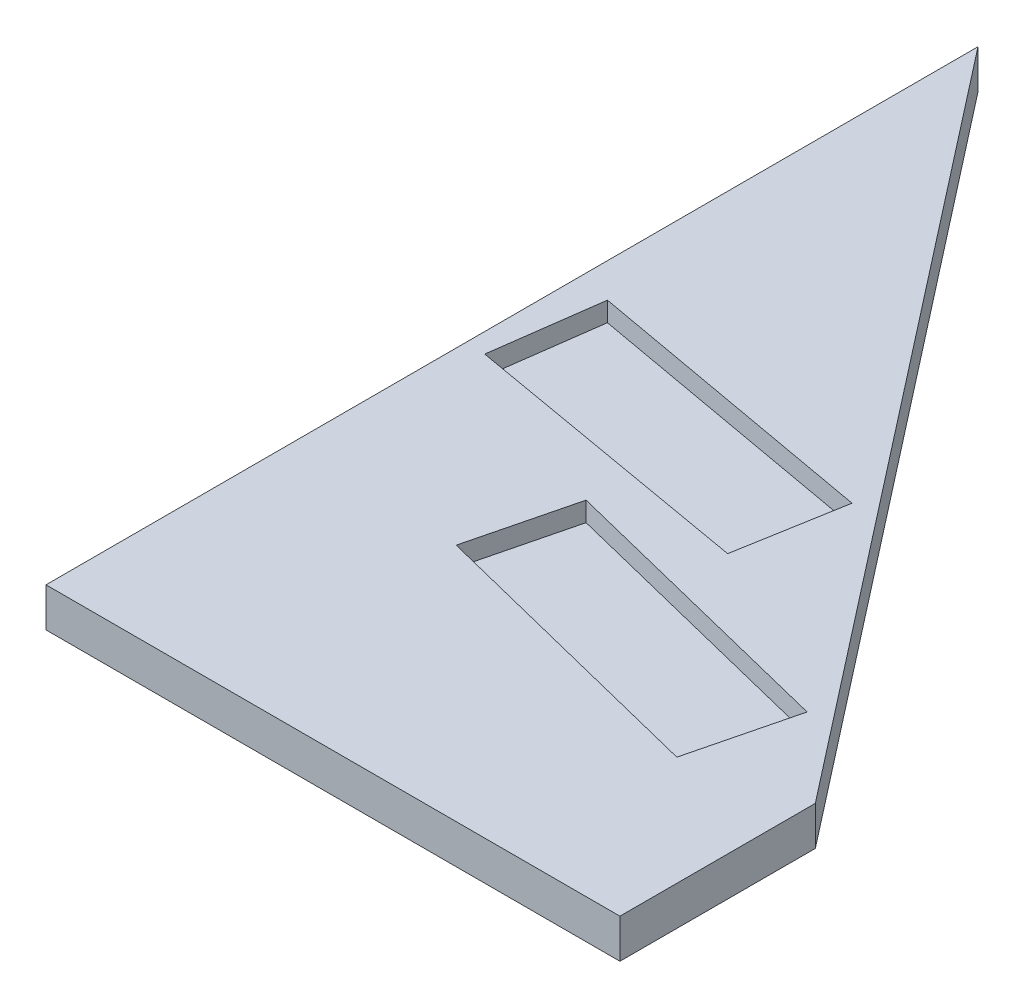
ISO-10303-21;
HEADER;
FILE_DESCRIPTION(('STEP AP214'),'2;1');
FILE_NAME('part.step','',(''),(''),'','','');
FILE_SCHEMA(('AUTOMOTIVE_DESIGN { 1 0 10303 214 1 1 1 1 }'));
ENDSEC;
DATA;
#1=APPLICATION_CONTEXT('core data for automotive mechanical design processes');
#2=APPLICATION_PROTOCOL_DEFINITION('international standard','automotive_design',2000,#1);
#3=PRODUCT_CONTEXT('',#1,'mechanical');
#4=PRODUCT('Part','Part','',(#3));
#5=PRODUCT_RELATED_PRODUCT_CATEGORY('part','',(#4));
#6=PRODUCT_DEFINITION_FORMATION('','',#4);
#7=PRODUCT_DEFINITION_CONTEXT('part definition',#1,'design');
#8=PRODUCT_DEFINITION('design','',#6,#7);
#9=PRODUCT_DEFINITION_SHAPE('','',#8);
#10=(LENGTH_UNIT() NAMED_UNIT(*) SI_UNIT(.MILLI.,.METRE.));
#11=(NAMED_UNIT(*) PLANE_ANGLE_UNIT() SI_UNIT($,.RADIAN.));
#12=(NAMED_UNIT(*) SI_UNIT($,.STERADIAN.) SOLID_ANGLE_UNIT());
#13=UNCERTAINTY_MEASURE_WITH_UNIT(LENGTH_MEASURE(1.E-05),#10,'distance_accuracy_value','');
#14=(GEOMETRIC_REPRESENTATION_CONTEXT(3) GLOBAL_UNCERTAINTY_ASSIGNED_CONTEXT((#13)) GLOBAL_UNIT_ASSIGNED_CONTEXT((#10,
#11,#12)) REPRESENTATION_CONTEXT('',''));
#15=CARTESIAN_POINT('',(0.,0.,0.));
#16=DIRECTION('',(0.,0.,1.));
#17=DIRECTION('',(1.,0.,0.));
#18=AXIS2_PLACEMENT_3D('',#15,#16,#17);
#19=CARTESIAN_POINT('',(-25.,4.,-50.39));
#20=DIRECTION('',(1.,0.,0.));
#21=DIRECTION('',(0.,0.,-1.));
#22=AXIS2_PLACEMENT_3D('',#19,#20,#21);
#23=PLANE('',#22);
#24=DIRECTION('',(0.,0.,1.));
#25=VECTOR('',#24,1.);
#26=CARTESIAN_POINT('',(-25.,0.,-50.39));
#27=LINE('',#26,#25);
#28=CARTESIAN_POINT('',(-25.,0.,-50.39));
#29=VERTEX_POINT('',#28);
#30=CARTESIAN_POINT('',(-25.,0.,45.));
#31=VERTEX_POINT('',#30);
#32=EDGE_CURVE('E216',#29,#31,#27,.T.);
#33=ORIENTED_EDGE('',*,*,#32,.T.);
#34=DIRECTION('',(0.,-1.,0.));
#35=VECTOR('',#34,1.);
#36=CARTESIAN_POINT('',(-25.,4.,45.));
#37=LINE('',#36,#35);
#38=CARTESIAN_POINT('',(-25.,4.,45.));
#39=VERTEX_POINT('',#38);
#40=EDGE_CURVE('E11',#39,#31,#37,.T.);
#41=ORIENTED_EDGE('',*,*,#40,.F.);
#42=DIRECTION('',(0.,0.,1.));
#43=VECTOR('',#42,1.);
#44=CARTESIAN_POINT('',(-25.,4.,-50.39));
#45=LINE('',#44,#43);
#46=CARTESIAN_POINT('',(-25.,4.,-50.39));
#47=VERTEX_POINT('',#46);
#48=EDGE_CURVE('E225',#47,#39,#45,.T.);
#49=ORIENTED_EDGE('',*,*,#48,.F.);
#50=DIRECTION('',(0.,-1.,0.));
#51=VECTOR('',#50,1.);
#52=CARTESIAN_POINT('',(-25.,4.,-50.39));
#53=LINE('',#52,#51);
#54=EDGE_CURVE('E239',#47,#29,#53,.T.);
#55=ORIENTED_EDGE('',*,*,#54,.T.);
#56=EDGE_LOOP('',(#33,#41,#49,#55));
#57=FACE_BOUND('',#56,.T.);
#58=ADVANCED_FACE('F43',(#57),#23,.F.);
#59=CARTESIAN_POINT('',(-25.,4.,45.));
#60=DIRECTION('',(0.,0.,-1.));
#61=DIRECTION('',(-1.,0.,0.));
#62=AXIS2_PLACEMENT_3D('',#59,#60,#61);
#63=PLANE('',#62);
#64=DIRECTION('',(1.,0.,0.));
#65=VECTOR('',#64,1.);
#66=CARTESIAN_POINT('',(-25.,0.,45.));
#67=LINE('',#66,#65);
#68=CARTESIAN_POINT('',(33.74,0.,45.));
#69=VERTEX_POINT('',#68);
#70=EDGE_CURVE('E243',#31,#69,#67,.T.);
#71=ORIENTED_EDGE('',*,*,#70,.T.);
#72=DIRECTION('',(0.,-1.,0.));
#73=VECTOR('',#72,1.);
#74=CARTESIAN_POINT('',(33.74,4.,45.));
#75=LINE('',#74,#73);
#76=CARTESIAN_POINT('',(33.74,4.,45.));
#77=VERTEX_POINT('',#76);
#78=EDGE_CURVE('E51',#77,#69,#75,.T.);
#79=ORIENTED_EDGE('',*,*,#78,.F.);
#80=DIRECTION('',(1.,0.,0.));
#81=VECTOR('',#80,1.);
#82=CARTESIAN_POINT('',(-25.,4.,45.));
#83=LINE('',#82,#81);
#84=EDGE_CURVE('E229',#39,#77,#83,.T.);
#85=ORIENTED_EDGE('',*,*,#84,.F.);
#86=ORIENTED_EDGE('',*,*,#40,.T.);
#87=EDGE_LOOP('',(#71,#79,#85,#86));
#88=FACE_BOUND('',#87,.T.);
#89=ADVANCED_FACE('F279',(#88),#63,.F.);
#90=CARTESIAN_POINT('',(33.74,4.,25.));
#91=DIRECTION('',(-1.,0.,0.));
#92=DIRECTION('',(0.,0.,1.));
#93=AXIS2_PLACEMENT_3D('',#90,#91,#92);
#94=PLANE('',#93);
#95=DIRECTION('',(0.,0.,-1.));
#96=VECTOR('',#95,1.);
#97=CARTESIAN_POINT('',(33.74,0.,25.));
#98=LINE('',#97,#96);
#99=CARTESIAN_POINT('',(33.74,0.,25.));
#100=VERTEX_POINT('',#99);
#101=EDGE_CURVE('E246',#69,#100,#98,.T.);
#102=ORIENTED_EDGE('',*,*,#101,.T.);
#103=DIRECTION('',(0.,-1.,0.));
#104=VECTOR('',#103,1.);
#105=CARTESIAN_POINT('',(33.74,4.,25.));
#106=LINE('',#105,#104);
#107=CARTESIAN_POINT('',(33.74,4.,25.));
#108=VERTEX_POINT('',#107);
#109=EDGE_CURVE('E254',#108,#100,#106,.T.);
#110=ORIENTED_EDGE('',*,*,#109,.F.);
#111=DIRECTION('',(0.,0.,-1.));
#112=VECTOR('',#111,1.);
#113=CARTESIAN_POINT('',(33.74,4.,25.));
#114=LINE('',#113,#112);
#115=EDGE_CURVE('E233',#77,#108,#114,.T.);
#116=ORIENTED_EDGE('',*,*,#115,.F.);
#117=ORIENTED_EDGE('',*,*,#78,.T.);
#118=EDGE_LOOP('',(#102,#110,#116,#117));
#119=FACE_BOUND('',#118,.T.);
#120=ADVANCED_FACE('F263',(#119),#94,.F.);
#121=CARTESIAN_POINT('',(-25.,4.,-50.39));
#122=DIRECTION('',(-0.788827960182436,0.,0.614614065275452));
#123=DIRECTION('',(0.614614065275452,0.,0.788827960182436));
#124=AXIS2_PLACEMENT_3D('',#121,#122,#123);
#125=PLANE('',#124);
#126=DIRECTION('',(-0.614614065275452,0.,-0.788827960182436));
#127=VECTOR('',#126,1.);
#128=CARTESIAN_POINT('',(-25.,0.,-50.39));
#129=LINE('',#128,#127);
#130=EDGE_CURVE('E230',#100,#29,#129,.T.);
#131=ORIENTED_EDGE('',*,*,#130,.T.);
#132=ORIENTED_EDGE('',*,*,#54,.F.);
#133=DIRECTION('',(-0.614614065275452,0.,-0.788827960182436));
#134=VECTOR('',#133,1.);
#135=CARTESIAN_POINT('',(-25.,4.,-50.39));
#136=LINE('',#135,#134);
#137=EDGE_CURVE('E236',#108,#47,#136,.T.);
#138=ORIENTED_EDGE('',*,*,#137,.F.);
#139=ORIENTED_EDGE('',*,*,#109,.T.);
#140=EDGE_LOOP('',(#131,#132,#138,#139));
#141=FACE_BOUND('',#140,.T.);
#142=ADVANCED_FACE('F272',(#141),#125,.F.);
#143=CARTESIAN_POINT('',(0.,4.,0.));
#144=DIRECTION('',(0.,1.,0.));
#145=DIRECTION('',(0.,0.,1.));
#146=AXIS2_PLACEMENT_3D('',#143,#144,#145);
#147=PLANE('',#146);
#148=DIRECTION('',(0.241921895599666,0.,-0.970295726275997));
#149=VECTOR('',#148,1.);
#150=CARTESIAN_POINT('',(25.2199539369007,4.,17.3190001281548));
#151=LINE('',#150,#149);
#152=CARTESIAN_POINT('',(22.5588130853044,4.,27.9922531171907));
#153=VERTEX_POINT('',#152);
#154=CARTESIAN_POINT('',(25.2199539369007,4.,17.3190001281548));
#155=VERTEX_POINT('',#154);
#156=EDGE_CURVE('E58',#153,#155,#151,.T.);
#157=ORIENTED_EDGE('',*,*,#156,.F.);
#158=DIRECTION('',(0.970295726275997,0.,0.241921895599665));
#159=VECTOR('',#158,1.);
#160=CARTESIAN_POINT('',(-7.52035442925152,4.,20.4926743536011));
#161=LINE('',#160,#159);
#162=CARTESIAN_POINT('',(-7.52035442925152,4.,20.4926743536011));
#163=VERTEX_POINT('',#162);
#164=EDGE_CURVE('E155',#163,#153,#161,.T.);
#165=ORIENTED_EDGE('',*,*,#164,.F.);
#166=DIRECTION('',(-0.241923731306296,0.,0.970295268581085));
#167=VECTOR('',#166,1.);
#168=CARTESIAN_POINT('',(-4.86786921668819,4.,9.85422297954813));
#169=LINE('',#168,#167);
#170=CARTESIAN_POINT('',(-4.86786921668819,4.,9.85422297954813));
#171=VERTEX_POINT('',#170);
#172=EDGE_CURVE('E159',#171,#163,#169,.T.);
#173=ORIENTED_EDGE('',*,*,#172,.F.);
#174=DIRECTION('',(-0.970574940438352,0.,-0.240799262858279));
#175=VECTOR('',#174,1.);
#176=CARTESIAN_POINT('',(-4.86786921668819,4.,9.85422297954813));
#177=LINE('',#176,#175);
#178=EDGE_CURVE('E168',#155,#171,#177,.T.);
#179=ORIENTED_EDGE('',*,*,#178,.F.);
#180=EDGE_LOOP('',(#157,#165,#173,#179));
#181=FACE_BOUND('',#180,.T.);
#182=DIRECTION('',(0.171929100279409,0.,-0.985109326154774));
#183=VECTOR('',#182,1.);
#184=CARTESIAN_POINT('',(7.12168316781315,4.,7.35422297954813));
#185=LINE('',#184,#183);
#186=CARTESIAN_POINT('',(7.12168316781315,4.,7.35422297954813));
#187=VERTEX_POINT('',#186);
#188=CARTESIAN_POINT('',(9.01290327088664,4.,-3.48197960815439));
#189=VERTEX_POINT('',#188);
#190=EDGE_CURVE('E66',#187,#189,#185,.T.);
#191=ORIENTED_EDGE('',*,*,#190,.F.);
#192=DIRECTION('',(0.985109326154775,0.,0.171929100279406));
#193=VECTOR('',#192,1.);
#194=CARTESIAN_POINT('',(-23.,4.,2.09714770024073));
#195=LINE('',#194,#193);
#196=CARTESIAN_POINT('',(-23.,4.,2.09714770024073));
#197=VERTEX_POINT('',#196);
#198=EDGE_CURVE('E187',#197,#187,#195,.T.);
#199=ORIENTED_EDGE('',*,*,#198,.F.);
#200=DIRECTION('',(-0.134499594691646,0.,0.99091364862322));
#201=VECTOR('',#200,1.);
#202=CARTESIAN_POINT('',(-23.,4.,2.09714770024073));
#203=LINE('',#202,#201);
#204=CARTESIAN_POINT('',(-21.49897830458,4.,-8.96149443382101));
#205=VERTEX_POINT('',#204);
#206=EDGE_CURVE('E206',#205,#197,#203,.T.);
#207=ORIENTED_EDGE('',*,*,#206,.F.);
#208=DIRECTION('',(-0.984254244369891,0.,-0.17675854276344));
#209=VECTOR('',#208,1.);
#210=CARTESIAN_POINT('',(-21.49897830458,4.,-8.96149443382101));
#211=LINE('',#210,#209);
#212=EDGE_CURVE('E202',#189,#205,#211,.T.);
#213=ORIENTED_EDGE('',*,*,#212,.F.);
#214=EDGE_LOOP('',(#191,#199,#207,#213));
#215=FACE_BOUND('',#214,.T.);
#216=ORIENTED_EDGE('',*,*,#48,.T.);
#217=ORIENTED_EDGE('',*,*,#84,.T.);
#218=ORIENTED_EDGE('',*,*,#115,.T.);
#219=ORIENTED_EDGE('',*,*,#137,.T.);
#220=EDGE_LOOP('',(#216,#217,#218,#219));
#221=FACE_BOUND('',#220,.T.);
#222=ADVANCED_FACE('F278',(#181,#215,#221),#147,.T.);
#223=CARTESIAN_POINT('',(0.,0.,0.));
#224=DIRECTION('',(0.,1.,0.));
#225=DIRECTION('',(0.,0.,1.));
#226=AXIS2_PLACEMENT_3D('',#223,#224,#225);
#227=PLANE('',#226);
#228=ORIENTED_EDGE('',*,*,#32,.F.);
#229=ORIENTED_EDGE('',*,*,#130,.F.);
#230=ORIENTED_EDGE('',*,*,#101,.F.);
#231=ORIENTED_EDGE('',*,*,#70,.F.);
#232=EDGE_LOOP('',(#228,#229,#230,#231));
#233=FACE_BOUND('',#232,.T.);
#234=ADVANCED_FACE('F269',(#233),#227,.F.);
#235=CARTESIAN_POINT('',(7.12168316781315,2.,7.35422297954813));
#236=DIRECTION('',(0.985109326154774,0.,0.171929100279409));
#237=DIRECTION('',(0.171929100279409,0.,-0.985109326154774));
#238=AXIS2_PLACEMENT_3D('',#235,#236,#237);
#239=PLANE('',#238);
#240=ORIENTED_EDGE('',*,*,#190,.T.);
#241=DIRECTION('',(0.,1.,0.));
#242=VECTOR('',#241,1.);
#243=CARTESIAN_POINT('',(9.01290327088664,2.,-3.48197960815439));
#244=LINE('',#243,#242);
#245=CARTESIAN_POINT('',(9.01290327088664,2.,-3.48197960815439));
#246=VERTEX_POINT('',#245);
#247=EDGE_CURVE('E199',#246,#189,#244,.T.);
#248=ORIENTED_EDGE('',*,*,#247,.F.);
#249=DIRECTION('',(0.171929100279409,0.,-0.985109326154774));
#250=VECTOR('',#249,1.);
#251=CARTESIAN_POINT('',(7.12168316781315,2.,7.35422297954813));
#252=LINE('',#251,#250);
#253=CARTESIAN_POINT('',(7.12168316781315,2.,7.35422297954813));
#254=VERTEX_POINT('',#253);
#255=EDGE_CURVE('E182',#254,#246,#252,.T.);
#256=ORIENTED_EDGE('',*,*,#255,.F.);
#257=DIRECTION('',(0.,1.,0.));
#258=VECTOR('',#257,1.);
#259=CARTESIAN_POINT('',(7.12168316781315,2.,7.35422297954813));
#260=LINE('',#259,#258);
#261=EDGE_CURVE('E213',#254,#187,#260,.T.);
#262=ORIENTED_EDGE('',*,*,#261,.T.);
#263=EDGE_LOOP('',(#240,#248,#256,#262));
#264=FACE_BOUND('',#263,.T.);
#265=ADVANCED_FACE('F291',(#264),#239,.F.);
#266=CARTESIAN_POINT('',(-23.,2.,2.09714770024073));
#267=DIRECTION('',(-0.171929100279406,0.,0.985109326154775));
#268=DIRECTION('',(0.985109326154775,0.,0.171929100279406));
#269=AXIS2_PLACEMENT_3D('',#266,#267,#268);
#270=PLANE('',#269);
#271=ORIENTED_EDGE('',*,*,#198,.T.);
#272=ORIENTED_EDGE('',*,*,#261,.F.);
#273=DIRECTION('',(0.985109326154775,0.,0.171929100279406));
#274=VECTOR('',#273,1.);
#275=CARTESIAN_POINT('',(-23.,2.,2.09714770024073));
#276=LINE('',#275,#274);
#277=CARTESIAN_POINT('',(-23.,2.,2.09714770024073));
#278=VERTEX_POINT('',#277);
#279=EDGE_CURVE('E195',#278,#254,#276,.T.);
#280=ORIENTED_EDGE('',*,*,#279,.F.);
#281=DIRECTION('',(0.,1.,0.));
#282=VECTOR('',#281,1.);
#283=CARTESIAN_POINT('',(-23.,2.,2.09714770024073));
#284=LINE('',#283,#282);
#285=EDGE_CURVE('E217',#278,#197,#284,.T.);
#286=ORIENTED_EDGE('',*,*,#285,.T.);
#287=EDGE_LOOP('',(#271,#272,#280,#286));
#288=FACE_BOUND('',#287,.T.);
#289=ADVANCED_FACE('F297',(#288),#270,.F.);
#290=CARTESIAN_POINT('',(-23.,2.,2.09714770024073));
#291=DIRECTION('',(-0.99091364862322,0.,-0.134499594691646));
#292=DIRECTION('',(-0.134499594691646,0.,0.99091364862322));
#293=AXIS2_PLACEMENT_3D('',#290,#291,#292);
#294=PLANE('',#293);
#295=ORIENTED_EDGE('',*,*,#206,.T.);
#296=ORIENTED_EDGE('',*,*,#285,.F.);
#297=DIRECTION('',(-0.134499594691646,0.,0.99091364862322));
#298=VECTOR('',#297,1.);
#299=CARTESIAN_POINT('',(-23.,2.,2.09714770024073));
#300=LINE('',#299,#298);
#301=CARTESIAN_POINT('',(-21.49897830458,2.,-8.96149443382101));
#302=VERTEX_POINT('',#301);
#303=EDGE_CURVE('E191',#302,#278,#300,.T.);
#304=ORIENTED_EDGE('',*,*,#303,.F.);
#305=DIRECTION('',(0.,1.,0.));
#306=VECTOR('',#305,1.);
#307=CARTESIAN_POINT('',(-21.49897830458,2.,-8.96149443382101));
#308=LINE('',#307,#306);
#309=EDGE_CURVE('E220',#302,#205,#308,.T.);
#310=ORIENTED_EDGE('',*,*,#309,.T.);
#311=EDGE_LOOP('',(#295,#296,#304,#310));
#312=FACE_BOUND('',#311,.T.);
#313=ADVANCED_FACE('F302',(#312),#294,.F.);
#314=CARTESIAN_POINT('',(-21.49897830458,2.,-8.96149443382101));
#315=DIRECTION('',(0.17675854276344,0.,-0.984254244369891));
#316=DIRECTION('',(-0.984254244369891,0.,-0.17675854276344));
#317=AXIS2_PLACEMENT_3D('',#314,#315,#316);
#318=PLANE('',#317);
#319=ORIENTED_EDGE('',*,*,#212,.T.);
#320=ORIENTED_EDGE('',*,*,#309,.F.);
#321=DIRECTION('',(-0.984254244369891,0.,-0.17675854276344));
#322=VECTOR('',#321,1.);
#323=CARTESIAN_POINT('',(-21.49897830458,2.,-8.96149443382101));
#324=LINE('',#323,#322);
#325=EDGE_CURVE('E186',#246,#302,#324,.T.);
#326=ORIENTED_EDGE('',*,*,#325,.F.);
#327=ORIENTED_EDGE('',*,*,#247,.T.);
#328=EDGE_LOOP('',(#319,#320,#326,#327));
#329=FACE_BOUND('',#328,.T.);
#330=ADVANCED_FACE('F298',(#329),#318,.F.);
#331=CARTESIAN_POINT('',(0.,2.,0.));
#332=DIRECTION('',(0.,-1.,0.));
#333=DIRECTION('',(0.,0.,-1.));
#334=AXIS2_PLACEMENT_3D('',#331,#332,#333);
#335=PLANE('',#334);
#336=ORIENTED_EDGE('',*,*,#255,.T.);
#337=ORIENTED_EDGE('',*,*,#325,.T.);
#338=ORIENTED_EDGE('',*,*,#303,.T.);
#339=ORIENTED_EDGE('',*,*,#279,.T.);
#340=EDGE_LOOP('',(#336,#337,#338,#339));
#341=FACE_BOUND('',#340,.T.);
#342=ADVANCED_FACE('F301',(#341),#335,.F.);
#343=CARTESIAN_POINT('',(25.2199539369007,2.,17.3190001281548));
#344=DIRECTION('',(0.970295726275997,0.,0.241921895599666));
#345=DIRECTION('',(0.241921895599666,0.,-0.970295726275997));
#346=AXIS2_PLACEMENT_3D('',#343,#344,#345);
#347=PLANE('',#346);
#348=ORIENTED_EDGE('',*,*,#156,.T.);
#349=DIRECTION('',(0.,1.,0.));
#350=VECTOR('',#349,1.);
#351=CARTESIAN_POINT('',(25.2199539369007,2.,17.3190001281548));
#352=LINE('',#351,#350);
#353=CARTESIAN_POINT('',(25.2199539369007,2.,17.3190001281548));
#354=VERTEX_POINT('',#353);
#355=EDGE_CURVE('E130',#354,#155,#352,.T.);
#356=ORIENTED_EDGE('',*,*,#355,.F.);
#357=DIRECTION('',(0.241921895599666,0.,-0.970295726275997));
#358=VECTOR('',#357,1.);
#359=CARTESIAN_POINT('',(25.2199539369007,2.,17.3190001281548));
#360=LINE('',#359,#358);
#361=CARTESIAN_POINT('',(22.5588130853044,2.,27.9922531171907));
#362=VERTEX_POINT('',#361);
#363=EDGE_CURVE('E134',#362,#354,#360,.T.);
#364=ORIENTED_EDGE('',*,*,#363,.F.);
#365=DIRECTION('',(0.,1.,0.));
#366=VECTOR('',#365,1.);
#367=CARTESIAN_POINT('',(22.5588130853044,2.,27.9922531171907));
#368=LINE('',#367,#366);
#369=EDGE_CURVE('E174',#362,#153,#368,.T.);
#370=ORIENTED_EDGE('',*,*,#369,.T.);
#371=EDGE_LOOP('',(#348,#356,#364,#370));
#372=FACE_BOUND('',#371,.T.);
#373=ADVANCED_FACE('F132',(#372),#347,.F.);
#374=CARTESIAN_POINT('',(-7.52035442925152,2.,20.4926743536011));
#375=DIRECTION('',(-0.241921895599665,0.,0.970295726275997));
#376=DIRECTION('',(0.970295726275997,0.,0.241921895599665));
#377=AXIS2_PLACEMENT_3D('',#374,#375,#376);
#378=PLANE('',#377);
#379=ORIENTED_EDGE('',*,*,#164,.T.);
#380=ORIENTED_EDGE('',*,*,#369,.F.);
#381=DIRECTION('',(0.970295726275997,0.,0.241921895599665));
#382=VECTOR('',#381,1.);
#383=CARTESIAN_POINT('',(-7.52035442925152,2.,20.4926743536011));
#384=LINE('',#383,#382);
#385=CARTESIAN_POINT('',(-7.52035442925152,2.,20.4926743536011));
#386=VERTEX_POINT('',#385);
#387=EDGE_CURVE('E141',#386,#362,#384,.T.);
#388=ORIENTED_EDGE('',*,*,#387,.F.);
#389=DIRECTION('',(0.,1.,0.));
#390=VECTOR('',#389,1.);
#391=CARTESIAN_POINT('',(-7.52035442925152,2.,20.4926743536011));
#392=LINE('',#391,#390);
#393=EDGE_CURVE('E177',#386,#163,#392,.T.);
#394=ORIENTED_EDGE('',*,*,#393,.T.);
#395=EDGE_LOOP('',(#379,#380,#388,#394));
#396=FACE_BOUND('',#395,.T.);
#397=ADVANCED_FACE('F315',(#396),#378,.F.);
#398=CARTESIAN_POINT('',(-4.86786921668819,2.,9.85422297954813));
#399=DIRECTION('',(-0.970295268581085,0.,-0.241923731306296));
#400=DIRECTION('',(-0.241923731306296,0.,0.970295268581085));
#401=AXIS2_PLACEMENT_3D('',#398,#399,#400);
#402=PLANE('',#401);
#403=ORIENTED_EDGE('',*,*,#172,.T.);
#404=ORIENTED_EDGE('',*,*,#393,.F.);
#405=DIRECTION('',(-0.241923731306296,0.,0.970295268581085));
#406=VECTOR('',#405,1.);
#407=CARTESIAN_POINT('',(-4.86786921668819,2.,9.85422297954813));
#408=LINE('',#407,#406);
#409=CARTESIAN_POINT('',(-4.86786921668819,2.,9.85422297954813));
#410=VERTEX_POINT('',#409);
#411=EDGE_CURVE('E150',#410,#386,#408,.T.);
#412=ORIENTED_EDGE('',*,*,#411,.F.);
#413=DIRECTION('',(0.,1.,0.));
#414=VECTOR('',#413,1.);
#415=CARTESIAN_POINT('',(-4.86786921668819,2.,9.85422297954813));
#416=LINE('',#415,#414);
#417=EDGE_CURVE('E140',#410,#171,#416,.T.);
#418=ORIENTED_EDGE('',*,*,#417,.T.);
#419=EDGE_LOOP('',(#403,#404,#412,#418));
#420=FACE_BOUND('',#419,.T.);
#421=ADVANCED_FACE('F318',(#420),#402,.F.);
#422=CARTESIAN_POINT('',(-4.86786921668819,2.,9.85422297954813));
#423=DIRECTION('',(0.240799262858279,0.,-0.970574940438351));
#424=DIRECTION('',(-0.970574940438351,0.,-0.240799262858279));
#425=AXIS2_PLACEMENT_3D('',#422,#423,#424);
#426=PLANE('',#425);
#427=ORIENTED_EDGE('',*,*,#178,.T.);
#428=ORIENTED_EDGE('',*,*,#417,.F.);
#429=DIRECTION('',(-0.970574940438352,0.,-0.240799262858279));
#430=VECTOR('',#429,1.);
#431=CARTESIAN_POINT('',(-4.86786921668819,2.,9.85422297954813));
#432=LINE('',#431,#430);
#433=EDGE_CURVE('E144',#354,#410,#432,.T.);
#434=ORIENTED_EDGE('',*,*,#433,.F.);
#435=ORIENTED_EDGE('',*,*,#355,.T.);
#436=EDGE_LOOP('',(#427,#428,#434,#435));
#437=FACE_BOUND('',#436,.T.);
#438=ADVANCED_FACE('F145',(#437),#426,.F.);
#439=CARTESIAN_POINT('',(0.,2.,0.));
#440=DIRECTION('',(0.,1.,0.));
#441=DIRECTION('',(0.,0.,1.));
#442=AXIS2_PLACEMENT_3D('',#439,#440,#441);
#443=PLANE('',#442);
#444=ORIENTED_EDGE('',*,*,#363,.T.);
#445=ORIENTED_EDGE('',*,*,#433,.T.);
#446=ORIENTED_EDGE('',*,*,#411,.T.);
#447=ORIENTED_EDGE('',*,*,#387,.T.);
#448=EDGE_LOOP('',(#444,#445,#446,#447));
#449=FACE_BOUND('',#448,.T.);
#450=ADVANCED_FACE('F152',(#449),#443,.T.);
#451=CLOSED_SHELL('',(#58,#89,#120,#142,#222,#234,#265,#289,#313,#330,#342,#373,#397,#421,#438,#450));
#452=MANIFOLD_SOLID_BREP('B2',#451);
#453=ADVANCED_BREP_SHAPE_REPRESENTATION('',(#18,#452),#14);
#454=SHAPE_DEFINITION_REPRESENTATION(#9,#453);
ENDSEC;
END-ISO-10303-21;
